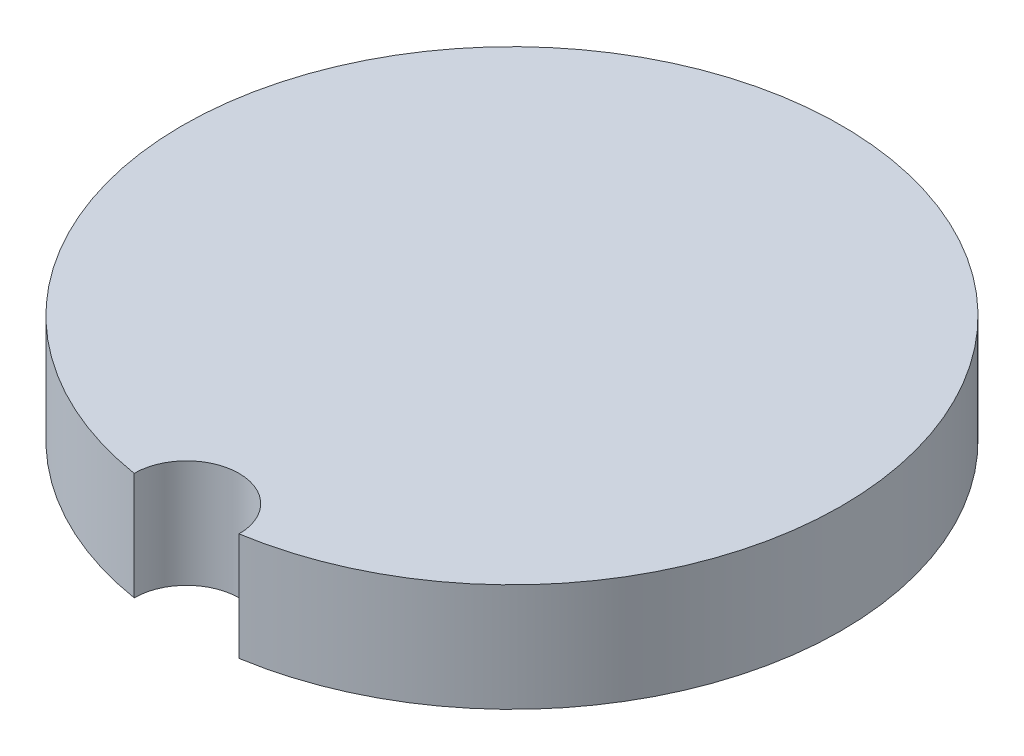
ISO-10303-21;
HEADER;
FILE_DESCRIPTION(('STEP AP214'),'2;1');
FILE_NAME('part.step','',(''),(''),'','','');
FILE_SCHEMA(('AUTOMOTIVE_DESIGN { 1 0 10303 214 1 1 1 1 }'));
ENDSEC;
DATA;
#1=APPLICATION_CONTEXT('core data for automotive mechanical design processes');
#2=APPLICATION_PROTOCOL_DEFINITION('international standard','automotive_design',2000,#1);
#3=PRODUCT_CONTEXT('',#1,'mechanical');
#4=PRODUCT('Part','Part','',(#3));
#5=PRODUCT_RELATED_PRODUCT_CATEGORY('part','',(#4));
#6=PRODUCT_DEFINITION_FORMATION('','',#4);
#7=PRODUCT_DEFINITION_CONTEXT('part definition',#1,'design');
#8=PRODUCT_DEFINITION('design','',#6,#7);
#9=PRODUCT_DEFINITION_SHAPE('','',#8);
#10=(LENGTH_UNIT() NAMED_UNIT(*) SI_UNIT(.MILLI.,.METRE.));
#11=(NAMED_UNIT(*) PLANE_ANGLE_UNIT() SI_UNIT($,.RADIAN.));
#12=(NAMED_UNIT(*) SI_UNIT($,.STERADIAN.) SOLID_ANGLE_UNIT());
#13=UNCERTAINTY_MEASURE_WITH_UNIT(LENGTH_MEASURE(1.E-05),#10,'distance_accuracy_value','');
#14=(GEOMETRIC_REPRESENTATION_CONTEXT(3) GLOBAL_UNCERTAINTY_ASSIGNED_CONTEXT((#13)) GLOBAL_UNIT_ASSIGNED_CONTEXT((#10,
#11,#12)) REPRESENTATION_CONTEXT('',''));
#15=CARTESIAN_POINT('',(0.,0.,0.));
#16=DIRECTION('',(0.,0.,1.));
#17=DIRECTION('',(1.,0.,0.));
#18=AXIS2_PLACEMENT_3D('',#15,#16,#17);
#19=CARTESIAN_POINT('',(0.,7.2,0.));
#20=DIRECTION('',(0.,-1.,0.));
#21=DIRECTION('',(0.,0.,-1.));
#22=AXIS2_PLACEMENT_3D('',#19,#20,#21);
#23=CYLINDRICAL_SURFACE('',#22,22.);
#24=CARTESIAN_POINT('',(0.,0.,0.));
#25=DIRECTION('',(0.,1.,0.));
#26=DIRECTION('',(0.,0.,1.));
#27=AXIS2_PLACEMENT_3D('',#24,#25,#26);
#28=CIRCLE('',#27,22.);
#29=CARTESIAN_POINT('',(3.5,0.,21.7198066289735));
#30=VERTEX_POINT('',#29);
#31=CARTESIAN_POINT('',(-3.5,0.,21.7198066289735));
#32=VERTEX_POINT('',#31);
#33=EDGE_CURVE('E67',#30,#32,#28,.T.);
#34=ORIENTED_EDGE('',*,*,#33,.T.);
#35=DIRECTION('',(0.,-1.,0.));
#36=VECTOR('',#35,1.);
#37=CARTESIAN_POINT('',(-3.5,3.6,21.7198066289735));
#38=LINE('',#37,#36);
#39=CARTESIAN_POINT('',(-3.5,7.2,21.7198066289735));
#40=VERTEX_POINT('',#39);
#41=EDGE_CURVE('E47',#32,#40,#38,.F.);
#42=ORIENTED_EDGE('',*,*,#41,.T.);
#43=CARTESIAN_POINT('',(0.,7.2,0.));
#44=DIRECTION('',(0.,1.,0.));
#45=DIRECTION('',(0.,0.,1.));
#46=AXIS2_PLACEMENT_3D('',#43,#44,#45);
#47=CIRCLE('',#46,22.);
#48=CARTESIAN_POINT('',(3.5,7.2,21.7198066289735));
#49=VERTEX_POINT('',#48);
#50=EDGE_CURVE('E40',#49,#40,#47,.T.);
#51=ORIENTED_EDGE('',*,*,#50,.F.);
#52=DIRECTION('',(0.,-1.,0.));
#53=VECTOR('',#52,1.);
#54=CARTESIAN_POINT('',(3.5,3.6,21.7198066289735));
#55=LINE('',#54,#53);
#56=EDGE_CURVE('E54',#49,#30,#55,.T.);
#57=ORIENTED_EDGE('',*,*,#56,.T.);
#58=EDGE_LOOP('',(#34,#42,#51,#57));
#59=FACE_BOUND('',#58,.T.);
#60=ADVANCED_FACE('F33',(#59),#23,.T.);
#61=CARTESIAN_POINT('',(0.,7.2,0.));
#62=DIRECTION('',(0.,1.,0.));
#63=DIRECTION('',(0.,0.,1.));
#64=AXIS2_PLACEMENT_3D('',#61,#62,#63);
#65=PLANE('',#64);
#66=CARTESIAN_POINT('',(0.,7.2,21.7198066289735));
#67=DIRECTION('',(0.,-1.,0.));
#68=DIRECTION('',(0.,0.,-1.));
#69=AXIS2_PLACEMENT_3D('',#66,#67,#68);
#70=CIRCLE('',#69,3.5);
#71=EDGE_CURVE('E57',#40,#49,#70,.T.);
#72=ORIENTED_EDGE('',*,*,#71,.T.);
#73=ORIENTED_EDGE('',*,*,#50,.T.);
#74=EDGE_LOOP('',(#72,#73));
#75=FACE_BOUND('',#74,.T.);
#76=ADVANCED_FACE('F65',(#75),#65,.T.);
#77=CARTESIAN_POINT('',(0.,0.,0.));
#78=DIRECTION('',(0.,1.,0.));
#79=DIRECTION('',(0.,0.,1.));
#80=AXIS2_PLACEMENT_3D('',#77,#78,#79);
#81=PLANE('',#80);
#82=ORIENTED_EDGE('',*,*,#33,.F.);
#83=CARTESIAN_POINT('',(0.,0.,21.7198066289735));
#84=DIRECTION('',(0.,1.,0.));
#85=DIRECTION('',(0.,0.,1.));
#86=AXIS2_PLACEMENT_3D('',#83,#84,#85);
#87=CIRCLE('',#86,3.5);
#88=EDGE_CURVE('E11',#30,#32,#87,.T.);
#89=ORIENTED_EDGE('',*,*,#88,.T.);
#90=EDGE_LOOP('',(#82,#89));
#91=FACE_BOUND('',#90,.T.);
#92=ADVANCED_FACE('F71',(#91),#81,.F.);
#93=CARTESIAN_POINT('',(0.,7.2,21.7198066289735));
#94=DIRECTION('',(0.,-1.,0.));
#95=DIRECTION('',(0.,0.,-1.));
#96=AXIS2_PLACEMENT_3D('',#93,#94,#95);
#97=CYLINDRICAL_SURFACE('',#96,3.5);
#98=ORIENTED_EDGE('',*,*,#88,.F.);
#99=ORIENTED_EDGE('',*,*,#56,.F.);
#100=ORIENTED_EDGE('',*,*,#71,.F.);
#101=ORIENTED_EDGE('',*,*,#41,.F.);
#102=EDGE_LOOP('',(#98,#99,#100,#101));
#103=FACE_BOUND('',#102,.T.);
#104=ADVANCED_FACE('F56',(#103),#97,.F.);
#105=CLOSED_SHELL('',(#60,#76,#92,#104));
#106=MANIFOLD_SOLID_BREP('B2',#105);
#107=ADVANCED_BREP_SHAPE_REPRESENTATION('',(#18,#106),#14);
#108=SHAPE_DEFINITION_REPRESENTATION(#9,#107);
ENDSEC;
END-ISO-10303-21;
